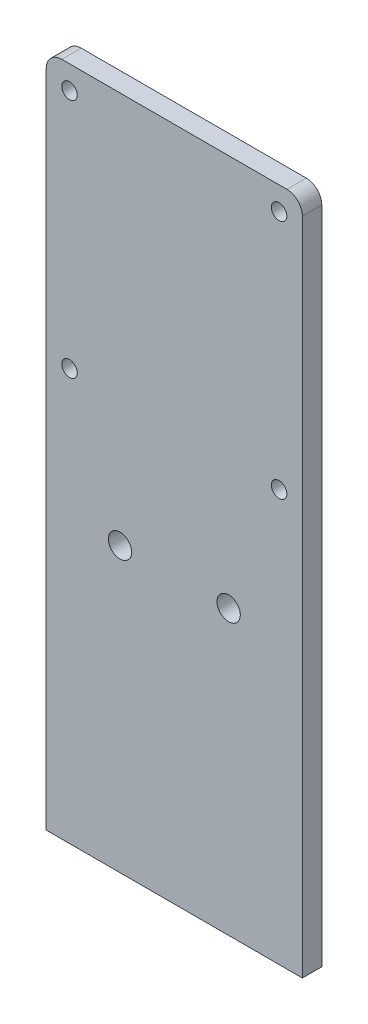
ISO-10303-21;
HEADER;
FILE_DESCRIPTION(('STEP AP214'),'2;1');
FILE_NAME('part.step','',(''),(''),'','','');
FILE_SCHEMA(('AUTOMOTIVE_DESIGN { 1 0 10303 214 1 1 1 1 }'));
ENDSEC;
DATA;
#1=APPLICATION_CONTEXT('core data for automotive mechanical design processes');
#2=APPLICATION_PROTOCOL_DEFINITION('international standard','automotive_design',2000,#1);
#3=PRODUCT_CONTEXT('',#1,'mechanical');
#4=PRODUCT('Part','Part','',(#3));
#5=PRODUCT_RELATED_PRODUCT_CATEGORY('part','',(#4));
#6=PRODUCT_DEFINITION_FORMATION('','',#4);
#7=PRODUCT_DEFINITION_CONTEXT('part definition',#1,'design');
#8=PRODUCT_DEFINITION('design','',#6,#7);
#9=PRODUCT_DEFINITION_SHAPE('','',#8);
#10=(LENGTH_UNIT() NAMED_UNIT(*) SI_UNIT(.MILLI.,.METRE.));
#11=(NAMED_UNIT(*) PLANE_ANGLE_UNIT() SI_UNIT($,.RADIAN.));
#12=(NAMED_UNIT(*) SI_UNIT($,.STERADIAN.) SOLID_ANGLE_UNIT());
#13=UNCERTAINTY_MEASURE_WITH_UNIT(LENGTH_MEASURE(1.E-05),#10,'distance_accuracy_value','');
#14=(GEOMETRIC_REPRESENTATION_CONTEXT(3) GLOBAL_UNCERTAINTY_ASSIGNED_CONTEXT((#13)) GLOBAL_UNIT_ASSIGNED_CONTEXT((#10,
#11,#12)) REPRESENTATION_CONTEXT('',''));
#15=CARTESIAN_POINT('',(0.,0.,0.));
#16=DIRECTION('',(0.,0.,1.));
#17=DIRECTION('',(1.,0.,0.));
#18=AXIS2_PLACEMENT_3D('',#15,#16,#17);
#19=CARTESIAN_POINT('',(2.,85.,2.5));
#20=DIRECTION('',(0.,0.,-1.));
#21=DIRECTION('',(-1.,0.,0.));
#22=AXIS2_PLACEMENT_3D('',#19,#20,#21);
#23=PLANE('',#22);
#24=DIRECTION('',(0.,-1.,0.));
#25=VECTOR('',#24,1.);
#26=CARTESIAN_POINT('',(0.,0.,2.5));
#27=LINE('',#26,#25);
#28=CARTESIAN_POINT('',(0.,85.,2.5));
#29=VERTEX_POINT('',#28);
#30=CARTESIAN_POINT('',(0.,0.,2.5));
#31=VERTEX_POINT('',#30);
#32=EDGE_CURVE('E152',#29,#31,#27,.T.);
#33=ORIENTED_EDGE('',*,*,#32,.T.);
#34=DIRECTION('',(1.,0.,0.));
#35=VECTOR('',#34,1.);
#36=CARTESIAN_POINT('',(0.,0.,2.5));
#37=LINE('',#36,#35);
#38=CARTESIAN_POINT('',(33.,0.,2.5));
#39=VERTEX_POINT('',#38);
#40=EDGE_CURVE('E100',#31,#39,#37,.T.);
#41=ORIENTED_EDGE('',*,*,#40,.T.);
#42=DIRECTION('',(0.,1.,0.));
#43=VECTOR('',#42,1.);
#44=CARTESIAN_POINT('',(33.,0.,2.5));
#45=LINE('',#44,#43);
#46=CARTESIAN_POINT('',(33.,85.,2.5));
#47=VERTEX_POINT('',#46);
#48=EDGE_CURVE('E113',#39,#47,#45,.T.);
#49=ORIENTED_EDGE('',*,*,#48,.T.);
#50=CARTESIAN_POINT('',(31.,85.,2.5));
#51=DIRECTION('',(0.,0.,1.));
#52=DIRECTION('',(1.,0.,0.));
#53=AXIS2_PLACEMENT_3D('',#50,#51,#52);
#54=CIRCLE('',#53,2.);
#55=CARTESIAN_POINT('',(31.,87.,2.5));
#56=VERTEX_POINT('',#55);
#57=EDGE_CURVE('E107',#47,#56,#54,.T.);
#58=ORIENTED_EDGE('',*,*,#57,.T.);
#59=DIRECTION('',(-1.,0.,0.));
#60=VECTOR('',#59,1.);
#61=CARTESIAN_POINT('',(2.00000000000001,87.,2.5));
#62=LINE('',#61,#60);
#63=CARTESIAN_POINT('',(2.00000000000001,87.,2.5));
#64=VERTEX_POINT('',#63);
#65=EDGE_CURVE('E111',#56,#64,#62,.T.);
#66=ORIENTED_EDGE('',*,*,#65,.T.);
#67=CARTESIAN_POINT('',(2.,85.,2.5));
#68=DIRECTION('',(0.,0.,1.));
#69=DIRECTION('',(-1.,0.,0.));
#70=AXIS2_PLACEMENT_3D('',#67,#68,#69);
#71=CIRCLE('',#70,2.);
#72=EDGE_CURVE('E63',#64,#29,#71,.T.);
#73=ORIENTED_EDGE('',*,*,#72,.T.);
#74=EDGE_LOOP('',(#33,#41,#49,#58,#66,#73));
#75=FACE_BOUND('',#74,.T.);
#76=CARTESIAN_POINT('',(3.,84.,2.5));
#77=DIRECTION('',(0.,0.,1.));
#78=DIRECTION('',(1.,0.,0.));
#79=AXIS2_PLACEMENT_3D('',#76,#77,#78);
#80=CIRCLE('',#79,1.);
#81=CARTESIAN_POINT('',(4.,84.,2.5));
#82=VERTEX_POINT('',#81);
#83=EDGE_CURVE('E140',#82,#82,#80,.T.);
#84=ORIENTED_EDGE('',*,*,#83,.F.);
#85=EDGE_LOOP('',(#84));
#86=FACE_BOUND('',#85,.T.);
#87=CARTESIAN_POINT('',(3.,53.,2.5));
#88=DIRECTION('',(0.,0.,1.));
#89=DIRECTION('',(-1.,0.,0.));
#90=AXIS2_PLACEMENT_3D('',#87,#88,#89);
#91=CIRCLE('',#90,1.);
#92=CARTESIAN_POINT('',(2.,53.,2.5));
#93=VERTEX_POINT('',#92);
#94=EDGE_CURVE('E248',#93,#93,#91,.T.);
#95=ORIENTED_EDGE('',*,*,#94,.F.);
#96=EDGE_LOOP('',(#95));
#97=FACE_BOUND('',#96,.T.);
#98=CARTESIAN_POINT('',(9.5,36.5,2.5));
#99=DIRECTION('',(0.,0.,1.));
#100=DIRECTION('',(1.,0.,0.));
#101=AXIS2_PLACEMENT_3D('',#98,#99,#100);
#102=CIRCLE('',#101,1.5);
#103=CARTESIAN_POINT('',(11.,36.5,2.5));
#104=VERTEX_POINT('',#103);
#105=EDGE_CURVE('E240',#104,#104,#102,.T.);
#106=ORIENTED_EDGE('',*,*,#105,.F.);
#107=EDGE_LOOP('',(#106));
#108=FACE_BOUND('',#107,.T.);
#109=CARTESIAN_POINT('',(23.5,36.5,2.5));
#110=DIRECTION('',(0.,0.,1.));
#111=DIRECTION('',(-1.,0.,0.));
#112=AXIS2_PLACEMENT_3D('',#109,#110,#111);
#113=CIRCLE('',#112,1.5);
#114=CARTESIAN_POINT('',(22.,36.5,2.5));
#115=VERTEX_POINT('',#114);
#116=EDGE_CURVE('E232',#115,#115,#113,.T.);
#117=ORIENTED_EDGE('',*,*,#116,.F.);
#118=EDGE_LOOP('',(#117));
#119=FACE_BOUND('',#118,.T.);
#120=CARTESIAN_POINT('',(30.,53.,2.5));
#121=DIRECTION('',(0.,0.,1.));
#122=DIRECTION('',(1.,0.,0.));
#123=AXIS2_PLACEMENT_3D('',#120,#121,#122);
#124=CIRCLE('',#123,1.);
#125=CARTESIAN_POINT('',(31.,53.,2.5));
#126=VERTEX_POINT('',#125);
#127=EDGE_CURVE('E224',#126,#126,#124,.T.);
#128=ORIENTED_EDGE('',*,*,#127,.F.);
#129=EDGE_LOOP('',(#128));
#130=FACE_BOUND('',#129,.T.);
#131=CARTESIAN_POINT('',(30.,84.,2.5));
#132=DIRECTION('',(0.,0.,1.));
#133=DIRECTION('',(-1.,0.,0.));
#134=AXIS2_PLACEMENT_3D('',#131,#132,#133);
#135=CIRCLE('',#134,1.);
#136=CARTESIAN_POINT('',(29.,84.,2.5));
#137=VERTEX_POINT('',#136);
#138=EDGE_CURVE('E213',#137,#137,#135,.T.);
#139=ORIENTED_EDGE('',*,*,#138,.F.);
#140=EDGE_LOOP('',(#139));
#141=FACE_BOUND('',#140,.T.);
#142=ADVANCED_FACE('F45',(#75,#86,#97,#108,#119,#130,#141),#23,.F.);
#143=CARTESIAN_POINT('',(2.,85.,0.));
#144=DIRECTION('',(0.,0.,-1.));
#145=DIRECTION('',(-1.,0.,0.));
#146=AXIS2_PLACEMENT_3D('',#143,#144,#145);
#147=PLANE('',#146);
#148=CARTESIAN_POINT('',(30.,53.,0.));
#149=DIRECTION('',(0.,0.,1.));
#150=DIRECTION('',(1.,0.,0.));
#151=AXIS2_PLACEMENT_3D('',#148,#149,#150);
#152=CIRCLE('',#151,1.);
#153=CARTESIAN_POINT('',(31.,53.,0.));
#154=VERTEX_POINT('',#153);
#155=EDGE_CURVE('E221',#154,#154,#152,.T.);
#156=ORIENTED_EDGE('',*,*,#155,.T.);
#157=EDGE_LOOP('',(#156));
#158=FACE_BOUND('',#157,.T.);
#159=CARTESIAN_POINT('',(9.5,36.5,0.));
#160=DIRECTION('',(0.,0.,1.));
#161=DIRECTION('',(1.,0.,0.));
#162=AXIS2_PLACEMENT_3D('',#159,#160,#161);
#163=CIRCLE('',#162,1.5);
#164=CARTESIAN_POINT('',(11.,36.5,0.));
#165=VERTEX_POINT('',#164);
#166=EDGE_CURVE('E236',#165,#165,#163,.T.);
#167=ORIENTED_EDGE('',*,*,#166,.T.);
#168=EDGE_LOOP('',(#167));
#169=FACE_BOUND('',#168,.T.);
#170=CARTESIAN_POINT('',(3.,84.,0.));
#171=DIRECTION('',(0.,0.,1.));
#172=DIRECTION('',(1.,0.,0.));
#173=AXIS2_PLACEMENT_3D('',#170,#171,#172);
#174=CIRCLE('',#173,1.);
#175=CARTESIAN_POINT('',(4.,84.,0.));
#176=VERTEX_POINT('',#175);
#177=EDGE_CURVE('E252',#176,#176,#174,.T.);
#178=ORIENTED_EDGE('',*,*,#177,.T.);
#179=EDGE_LOOP('',(#178));
#180=FACE_BOUND('',#179,.T.);
#181=DIRECTION('',(0.,-1.,0.));
#182=VECTOR('',#181,1.);
#183=CARTESIAN_POINT('',(0.,0.,0.));
#184=LINE('',#183,#182);
#185=CARTESIAN_POINT('',(0.,85.,0.));
#186=VERTEX_POINT('',#185);
#187=CARTESIAN_POINT('',(0.,0.,0.));
#188=VERTEX_POINT('',#187);
#189=EDGE_CURVE('E135',#186,#188,#184,.T.);
#190=ORIENTED_EDGE('',*,*,#189,.F.);
#191=CARTESIAN_POINT('',(2.,85.,0.));
#192=DIRECTION('',(0.,0.,1.));
#193=DIRECTION('',(-1.,0.,0.));
#194=AXIS2_PLACEMENT_3D('',#191,#192,#193);
#195=CIRCLE('',#194,2.);
#196=CARTESIAN_POINT('',(2.00000000000001,87.,0.));
#197=VERTEX_POINT('',#196);
#198=EDGE_CURVE('E92',#197,#186,#195,.T.);
#199=ORIENTED_EDGE('',*,*,#198,.F.);
#200=DIRECTION('',(-1.,0.,0.));
#201=VECTOR('',#200,1.);
#202=CARTESIAN_POINT('',(2.00000000000001,87.,0.));
#203=LINE('',#202,#201);
#204=CARTESIAN_POINT('',(31.,87.,0.));
#205=VERTEX_POINT('',#204);
#206=EDGE_CURVE('E86',#205,#197,#203,.T.);
#207=ORIENTED_EDGE('',*,*,#206,.F.);
#208=CARTESIAN_POINT('',(31.,85.,0.));
#209=DIRECTION('',(0.,0.,1.));
#210=DIRECTION('',(1.,0.,0.));
#211=AXIS2_PLACEMENT_3D('',#208,#209,#210);
#212=CIRCLE('',#211,2.);
#213=CARTESIAN_POINT('',(33.,85.,0.));
#214=VERTEX_POINT('',#213);
#215=EDGE_CURVE('E122',#214,#205,#212,.T.);
#216=ORIENTED_EDGE('',*,*,#215,.F.);
#217=DIRECTION('',(0.,1.,0.));
#218=VECTOR('',#217,1.);
#219=CARTESIAN_POINT('',(33.,0.,0.));
#220=LINE('',#219,#218);
#221=CARTESIAN_POINT('',(33.,0.,0.));
#222=VERTEX_POINT('',#221);
#223=EDGE_CURVE('E143',#222,#214,#220,.T.);
#224=ORIENTED_EDGE('',*,*,#223,.F.);
#225=DIRECTION('',(1.,0.,0.));
#226=VECTOR('',#225,1.);
#227=CARTESIAN_POINT('',(0.,0.,0.));
#228=LINE('',#227,#226);
#229=EDGE_CURVE('E139',#188,#222,#228,.T.);
#230=ORIENTED_EDGE('',*,*,#229,.F.);
#231=EDGE_LOOP('',(#190,#199,#207,#216,#224,#230));
#232=FACE_BOUND('',#231,.T.);
#233=CARTESIAN_POINT('',(3.,53.,0.));
#234=DIRECTION('',(0.,0.,1.));
#235=DIRECTION('',(-1.,0.,0.));
#236=AXIS2_PLACEMENT_3D('',#233,#234,#235);
#237=CIRCLE('',#236,1.);
#238=CARTESIAN_POINT('',(2.,53.,0.));
#239=VERTEX_POINT('',#238);
#240=EDGE_CURVE('E244',#239,#239,#237,.T.);
#241=ORIENTED_EDGE('',*,*,#240,.T.);
#242=EDGE_LOOP('',(#241));
#243=FACE_BOUND('',#242,.T.);
#244=CARTESIAN_POINT('',(23.5,36.5,0.));
#245=DIRECTION('',(0.,0.,1.));
#246=DIRECTION('',(-1.,0.,0.));
#247=AXIS2_PLACEMENT_3D('',#244,#245,#246);
#248=CIRCLE('',#247,1.5);
#249=CARTESIAN_POINT('',(22.,36.5,0.));
#250=VERTEX_POINT('',#249);
#251=EDGE_CURVE('E228',#250,#250,#248,.T.);
#252=ORIENTED_EDGE('',*,*,#251,.T.);
#253=EDGE_LOOP('',(#252));
#254=FACE_BOUND('',#253,.T.);
#255=CARTESIAN_POINT('',(30.,84.,0.));
#256=DIRECTION('',(0.,0.,1.));
#257=DIRECTION('',(-1.,0.,0.));
#258=AXIS2_PLACEMENT_3D('',#255,#256,#257);
#259=CIRCLE('',#258,1.);
#260=CARTESIAN_POINT('',(29.,84.,0.));
#261=VERTEX_POINT('',#260);
#262=EDGE_CURVE('E216',#261,#261,#259,.T.);
#263=ORIENTED_EDGE('',*,*,#262,.T.);
#264=EDGE_LOOP('',(#263));
#265=FACE_BOUND('',#264,.T.);
#266=ADVANCED_FACE('F165',(#158,#169,#180,#232,#243,#254,#265),#147,.T.);
#267=CARTESIAN_POINT('',(0.,0.,2.5));
#268=DIRECTION('',(1.,0.,0.));
#269=DIRECTION('',(0.,0.,-1.));
#270=AXIS2_PLACEMENT_3D('',#267,#268,#269);
#271=PLANE('',#270);
#272=ORIENTED_EDGE('',*,*,#189,.T.);
#273=DIRECTION('',(0.,0.,-1.));
#274=VECTOR('',#273,1.);
#275=CARTESIAN_POINT('',(0.,0.,2.5));
#276=LINE('',#275,#274);
#277=EDGE_CURVE('E11',#31,#188,#276,.T.);
#278=ORIENTED_EDGE('',*,*,#277,.F.);
#279=ORIENTED_EDGE('',*,*,#32,.F.);
#280=DIRECTION('',(0.,0.,-1.));
#281=VECTOR('',#280,1.);
#282=CARTESIAN_POINT('',(0.,85.,2.5));
#283=LINE('',#282,#281);
#284=EDGE_CURVE('E131',#29,#186,#283,.T.);
#285=ORIENTED_EDGE('',*,*,#284,.T.);
#286=EDGE_LOOP('',(#272,#278,#279,#285));
#287=FACE_BOUND('',#286,.T.);
#288=ADVANCED_FACE('F47',(#287),#271,.F.);
#289=CARTESIAN_POINT('',(0.,0.,2.5));
#290=DIRECTION('',(0.,1.,0.));
#291=DIRECTION('',(0.,0.,1.));
#292=AXIS2_PLACEMENT_3D('',#289,#290,#291);
#293=PLANE('',#292);
#294=ORIENTED_EDGE('',*,*,#229,.T.);
#295=DIRECTION('',(0.,0.,-1.));
#296=VECTOR('',#295,1.);
#297=CARTESIAN_POINT('',(33.,0.,2.5));
#298=LINE('',#297,#296);
#299=EDGE_CURVE('E55',#39,#222,#298,.T.);
#300=ORIENTED_EDGE('',*,*,#299,.F.);
#301=ORIENTED_EDGE('',*,*,#40,.F.);
#302=ORIENTED_EDGE('',*,*,#277,.T.);
#303=EDGE_LOOP('',(#294,#300,#301,#302));
#304=FACE_BOUND('',#303,.T.);
#305=ADVANCED_FACE('F342',(#304),#293,.F.);
#306=CARTESIAN_POINT('',(33.,0.,2.5));
#307=DIRECTION('',(-1.,0.,0.));
#308=DIRECTION('',(0.,0.,1.));
#309=AXIS2_PLACEMENT_3D('',#306,#307,#308);
#310=PLANE('',#309);
#311=ORIENTED_EDGE('',*,*,#223,.T.);
#312=DIRECTION('',(0.,0.,-1.));
#313=VECTOR('',#312,1.);
#314=CARTESIAN_POINT('',(33.,85.,2.5));
#315=LINE('',#314,#313);
#316=EDGE_CURVE('E124',#47,#214,#315,.T.);
#317=ORIENTED_EDGE('',*,*,#316,.F.);
#318=ORIENTED_EDGE('',*,*,#48,.F.);
#319=ORIENTED_EDGE('',*,*,#299,.T.);
#320=EDGE_LOOP('',(#311,#317,#318,#319));
#321=FACE_BOUND('',#320,.T.);
#322=ADVANCED_FACE('F162',(#321),#310,.F.);
#323=CARTESIAN_POINT('',(31.,85.,2.5));
#324=DIRECTION('',(0.,0.,-1.));
#325=DIRECTION('',(-1.,0.,0.));
#326=AXIS2_PLACEMENT_3D('',#323,#324,#325);
#327=CYLINDRICAL_SURFACE('',#326,2.);
#328=ORIENTED_EDGE('',*,*,#215,.T.);
#329=DIRECTION('',(0.,0.,-1.));
#330=VECTOR('',#329,1.);
#331=CARTESIAN_POINT('',(31.,87.,2.5));
#332=LINE('',#331,#330);
#333=EDGE_CURVE('E119',#56,#205,#332,.T.);
#334=ORIENTED_EDGE('',*,*,#333,.F.);
#335=ORIENTED_EDGE('',*,*,#57,.F.);
#336=ORIENTED_EDGE('',*,*,#316,.T.);
#337=EDGE_LOOP('',(#328,#334,#335,#336));
#338=FACE_BOUND('',#337,.T.);
#339=ADVANCED_FACE('F120',(#338),#327,.T.);
#340=CARTESIAN_POINT('',(2.00000000000001,87.,2.5));
#341=DIRECTION('',(0.,-1.,0.));
#342=DIRECTION('',(0.,0.,-1.));
#343=AXIS2_PLACEMENT_3D('',#340,#341,#342);
#344=PLANE('',#343);
#345=ORIENTED_EDGE('',*,*,#206,.T.);
#346=DIRECTION('',(0.,0.,-1.));
#347=VECTOR('',#346,1.);
#348=CARTESIAN_POINT('',(2.00000000000001,87.,2.5));
#349=LINE('',#348,#347);
#350=EDGE_CURVE('E125',#64,#197,#349,.T.);
#351=ORIENTED_EDGE('',*,*,#350,.F.);
#352=ORIENTED_EDGE('',*,*,#65,.F.);
#353=ORIENTED_EDGE('',*,*,#333,.T.);
#354=EDGE_LOOP('',(#345,#351,#352,#353));
#355=FACE_BOUND('',#354,.T.);
#356=ADVANCED_FACE('F127',(#355),#344,.F.);
#357=CARTESIAN_POINT('',(2.,85.,2.5));
#358=DIRECTION('',(0.,0.,-1.));
#359=DIRECTION('',(-1.,0.,0.));
#360=AXIS2_PLACEMENT_3D('',#357,#358,#359);
#361=CYLINDRICAL_SURFACE('',#360,2.);
#362=ORIENTED_EDGE('',*,*,#198,.T.);
#363=ORIENTED_EDGE('',*,*,#284,.F.);
#364=ORIENTED_EDGE('',*,*,#72,.F.);
#365=ORIENTED_EDGE('',*,*,#350,.T.);
#366=EDGE_LOOP('',(#362,#363,#364,#365));
#367=FACE_BOUND('',#366,.T.);
#368=ADVANCED_FACE('F170',(#367),#361,.T.);
#369=CARTESIAN_POINT('',(3.,84.,2.5));
#370=DIRECTION('',(0.,0.,-1.));
#371=DIRECTION('',(-1.,0.,0.));
#372=AXIS2_PLACEMENT_3D('',#369,#370,#371);
#373=CYLINDRICAL_SURFACE('',#372,1.);
#374=ORIENTED_EDGE('',*,*,#83,.T.);
#375=EDGE_LOOP('',(#374));
#376=FACE_BOUND('',#375,.T.);
#377=ORIENTED_EDGE('',*,*,#177,.F.);
#378=EDGE_LOOP('',(#377));
#379=FACE_BOUND('',#378,.T.);
#380=ADVANCED_FACE('F172',(#376,#379),#373,.F.);
#381=CARTESIAN_POINT('',(3.,53.,2.5));
#382=DIRECTION('',(0.,0.,-1.));
#383=DIRECTION('',(-1.,0.,0.));
#384=AXIS2_PLACEMENT_3D('',#381,#382,#383);
#385=CYLINDRICAL_SURFACE('',#384,1.);
#386=ORIENTED_EDGE('',*,*,#94,.T.);
#387=EDGE_LOOP('',(#386));
#388=FACE_BOUND('',#387,.T.);
#389=ORIENTED_EDGE('',*,*,#240,.F.);
#390=EDGE_LOOP('',(#389));
#391=FACE_BOUND('',#390,.T.);
#392=ADVANCED_FACE('F178',(#388,#391),#385,.F.);
#393=CARTESIAN_POINT('',(9.5,36.5,2.5));
#394=DIRECTION('',(0.,0.,-1.));
#395=DIRECTION('',(-1.,0.,0.));
#396=AXIS2_PLACEMENT_3D('',#393,#394,#395);
#397=CYLINDRICAL_SURFACE('',#396,1.5);
#398=ORIENTED_EDGE('',*,*,#105,.T.);
#399=EDGE_LOOP('',(#398));
#400=FACE_BOUND('',#399,.T.);
#401=ORIENTED_EDGE('',*,*,#166,.F.);
#402=EDGE_LOOP('',(#401));
#403=FACE_BOUND('',#402,.T.);
#404=ADVANCED_FACE('F192',(#400,#403),#397,.F.);
#405=CARTESIAN_POINT('',(23.5,36.5,2.5));
#406=DIRECTION('',(0.,0.,-1.));
#407=DIRECTION('',(-1.,0.,0.));
#408=AXIS2_PLACEMENT_3D('',#405,#406,#407);
#409=CYLINDRICAL_SURFACE('',#408,1.5);
#410=ORIENTED_EDGE('',*,*,#116,.T.);
#411=EDGE_LOOP('',(#410));
#412=FACE_BOUND('',#411,.T.);
#413=ORIENTED_EDGE('',*,*,#251,.F.);
#414=EDGE_LOOP('',(#413));
#415=FACE_BOUND('',#414,.T.);
#416=ADVANCED_FACE('F196',(#412,#415),#409,.F.);
#417=CARTESIAN_POINT('',(30.,53.,2.5));
#418=DIRECTION('',(0.,0.,-1.));
#419=DIRECTION('',(-1.,0.,0.));
#420=AXIS2_PLACEMENT_3D('',#417,#418,#419);
#421=CYLINDRICAL_SURFACE('',#420,1.);
#422=ORIENTED_EDGE('',*,*,#127,.T.);
#423=EDGE_LOOP('',(#422));
#424=FACE_BOUND('',#423,.T.);
#425=ORIENTED_EDGE('',*,*,#155,.F.);
#426=EDGE_LOOP('',(#425));
#427=FACE_BOUND('',#426,.T.);
#428=ADVANCED_FACE('F200',(#424,#427),#421,.F.);
#429=CARTESIAN_POINT('',(30.,84.,2.5));
#430=DIRECTION('',(0.,0.,-1.));
#431=DIRECTION('',(-1.,0.,0.));
#432=AXIS2_PLACEMENT_3D('',#429,#430,#431);
#433=CYLINDRICAL_SURFACE('',#432,1.);
#434=ORIENTED_EDGE('',*,*,#138,.T.);
#435=EDGE_LOOP('',(#434));
#436=FACE_BOUND('',#435,.T.);
#437=ORIENTED_EDGE('',*,*,#262,.F.);
#438=EDGE_LOOP('',(#437));
#439=FACE_BOUND('',#438,.T.);
#440=ADVANCED_FACE('F204',(#436,#439),#433,.F.);
#441=CLOSED_SHELL('',(#142,#266,#288,#305,#322,#339,#356,#368,#380,#392,#404,#416,#428,#440));
#442=MANIFOLD_SOLID_BREP('B2',#441);
#443=ADVANCED_BREP_SHAPE_REPRESENTATION('',(#18,#442),#14);
#444=SHAPE_DEFINITION_REPRESENTATION(#9,#443);
ENDSEC;
END-ISO-10303-21;
